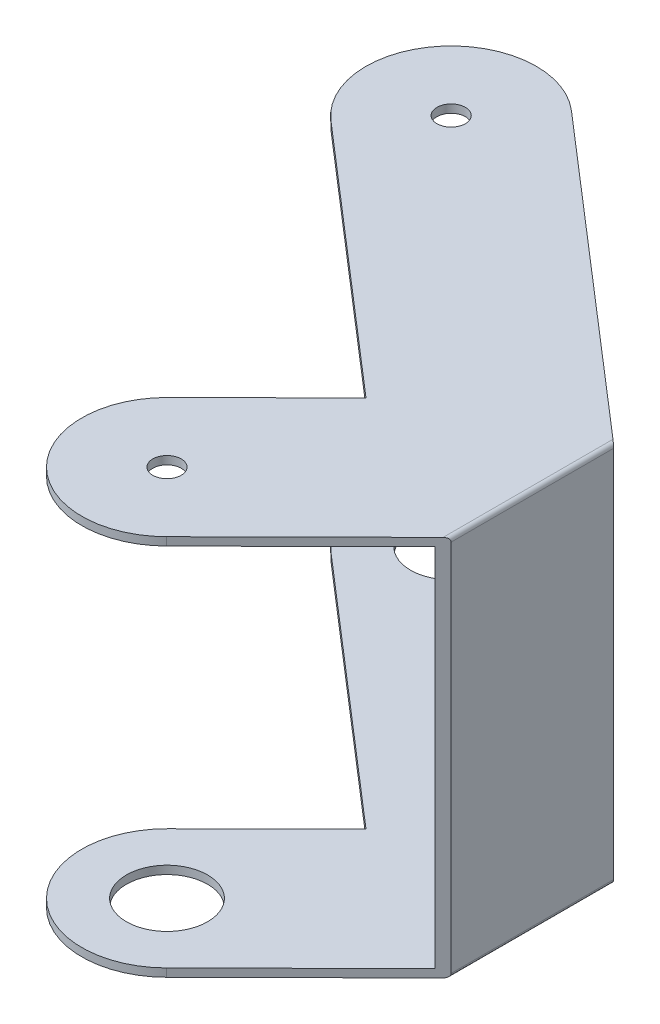
ISO-10303-21;
HEADER;
FILE_DESCRIPTION(('STEP AP214'),'2;1');
FILE_NAME('part.step','',(''),(''),'','','');
FILE_SCHEMA(('AUTOMOTIVE_DESIGN { 1 0 10303 214 1 1 1 1 }'));
ENDSEC;
DATA;
#1=APPLICATION_CONTEXT('core data for automotive mechanical design processes');
#2=APPLICATION_PROTOCOL_DEFINITION('international standard','automotive_design',2000,#1);
#3=PRODUCT_CONTEXT('',#1,'mechanical');
#4=PRODUCT('Part','Part','',(#3));
#5=PRODUCT_RELATED_PRODUCT_CATEGORY('part','',(#4));
#6=PRODUCT_DEFINITION_FORMATION('','',#4);
#7=PRODUCT_DEFINITION_CONTEXT('part definition',#1,'design');
#8=PRODUCT_DEFINITION('design','',#6,#7);
#9=PRODUCT_DEFINITION_SHAPE('','',#8);
#10=(LENGTH_UNIT() NAMED_UNIT(*) SI_UNIT(.MILLI.,.METRE.));
#11=(NAMED_UNIT(*) PLANE_ANGLE_UNIT() SI_UNIT($,.RADIAN.));
#12=(NAMED_UNIT(*) SI_UNIT($,.STERADIAN.) SOLID_ANGLE_UNIT());
#13=UNCERTAINTY_MEASURE_WITH_UNIT(LENGTH_MEASURE(1.E-05),#10,'distance_accuracy_value','');
#14=(GEOMETRIC_REPRESENTATION_CONTEXT(3) GLOBAL_UNCERTAINTY_ASSIGNED_CONTEXT((#13)) GLOBAL_UNIT_ASSIGNED_CONTEXT((#10,
#11,#12)) REPRESENTATION_CONTEXT('',''));
#15=CARTESIAN_POINT('',(0.,0.,0.));
#16=DIRECTION('',(0.,0.,1.));
#17=DIRECTION('',(1.,0.,0.));
#18=AXIS2_PLACEMENT_3D('',#15,#16,#17);
#19=CARTESIAN_POINT('',(-20.,0.,-55.));
#20=DIRECTION('',(0.,1.,0.));
#21=DIRECTION('',(0.,0.,1.));
#22=AXIS2_PLACEMENT_3D('',#19,#20,#21);
#23=PLANE('',#22);
#24=DIRECTION('',(-0.756723379962,0.,-0.65373521109));
#25=VECTOR('',#24,1.);
#26=CARTESIAN_POINT('',(25.,0.,-30.));
#27=LINE('',#26,#25);
#28=CARTESIAN_POINT('',(24.5,0.,-30.4319512442729));
#29=VERTEX_POINT('',#28);
#30=CARTESIAN_POINT('',(-13.135780283555,0.,-62.945595489601));
#31=VERTEX_POINT('',#30);
#32=EDGE_CURVE('E208',#29,#31,#27,.T.);
#33=ORIENTED_EDGE('',*,*,#32,.F.);
#34=DIRECTION('',(0.,0.,1.));
#35=VECTOR('',#34,1.);
#36=CARTESIAN_POINT('',(24.5,0.,-10.));
#37=LINE('',#36,#35);
#38=CARTESIAN_POINT('',(24.5,0.,-9.50428499112912));
#39=VERTEX_POINT('',#38);
#40=EDGE_CURVE('E257',#29,#39,#37,.T.);
#41=ORIENTED_EDGE('',*,*,#40,.T.);
#42=DIRECTION('',(-0.710143190911547,0.,0.704057276364619));
#43=VECTOR('',#42,1.);
#44=CARTESIAN_POINT('',(25.,0.,-10.));
#45=LINE('',#44,#43);
#46=CARTESIAN_POINT('',(7.3926014018285,0.,7.45650350457125));
#47=VERTEX_POINT('',#46);
#48=EDGE_CURVE('E231',#39,#47,#45,.T.);
#49=ORIENTED_EDGE('',*,*,#48,.T.);
#50=CARTESIAN_POINT('',(0.,0.,0.));
#51=DIRECTION('',(0.,1.,0.));
#52=DIRECTION('',(0.,0.,1.));
#53=AXIS2_PLACEMENT_3D('',#50,#51,#52);
#54=CIRCLE('',#53,10.5);
#55=CARTESIAN_POINT('',(-7.3926014018285,0.,-7.45650350457125));
#56=VERTEX_POINT('',#55);
#57=EDGE_CURVE('E228',#56,#47,#54,.T.);
#58=ORIENTED_EDGE('',*,*,#57,.F.);
#59=DIRECTION('',(0.710143190911547,0.,-0.704057276364619));
#60=VECTOR('',#59,1.);
#61=CARTESIAN_POINT('',(-7.3926014018285,0.,-7.45650350457125));
#62=LINE('',#61,#60);
#63=CARTESIAN_POINT('',(4.88353854108096,0.,-19.6274371459702));
#64=VERTEX_POINT('',#63);
#65=EDGE_CURVE('E225',#56,#64,#62,.T.);
#66=ORIENTED_EDGE('',*,*,#65,.T.);
#67=DIRECTION('',(0.756723379962,0.,0.65373521109));
#68=VECTOR('',#67,1.);
#69=CARTESIAN_POINT('',(-26.864219716445,0.,-47.054404510399));
#70=LINE('',#69,#68);
#71=CARTESIAN_POINT('',(-26.864219716445,0.,-47.054404510399));
#72=VERTEX_POINT('',#71);
#73=EDGE_CURVE('E222',#72,#64,#70,.T.);
#74=ORIENTED_EDGE('',*,*,#73,.F.);
#75=CARTESIAN_POINT('',(-20.,0.,-55.));
#76=DIRECTION('',(0.,1.,0.));
#77=DIRECTION('',(0.,0.,1.));
#78=AXIS2_PLACEMENT_3D('',#75,#76,#77);
#79=CIRCLE('',#78,10.5);
#80=EDGE_CURVE('E193',#31,#72,#79,.T.);
#81=ORIENTED_EDGE('',*,*,#80,.F.);
#82=EDGE_LOOP('',(#33,#41,#49,#58,#66,#74,#81));
#83=FACE_BOUND('',#82,.T.);
#84=CARTESIAN_POINT('',(-20.,0.,-55.));
#85=DIRECTION('',(0.,-1.,0.));
#86=DIRECTION('',(0.,0.,-1.));
#87=AXIS2_PLACEMENT_3D('',#84,#85,#86);
#88=CIRCLE('',#87,5.);
#89=CARTESIAN_POINT('',(-20.,0.,-60.));
#90=VERTEX_POINT('',#89);
#91=EDGE_CURVE('E312',#90,#90,#88,.T.);
#92=ORIENTED_EDGE('',*,*,#91,.F.);
#93=EDGE_LOOP('',(#92));
#94=FACE_BOUND('',#93,.T.);
#95=CARTESIAN_POINT('',(0.,0.,0.));
#96=DIRECTION('',(0.,-1.,0.));
#97=DIRECTION('',(0.,0.,-1.));
#98=AXIS2_PLACEMENT_3D('',#95,#96,#97);
#99=CIRCLE('',#98,5.);
#100=CARTESIAN_POINT('',(0.,0.,-5.));
#101=VERTEX_POINT('',#100);
#102=EDGE_CURVE('E318',#101,#101,#99,.T.);
#103=ORIENTED_EDGE('',*,*,#102,.F.);
#104=EDGE_LOOP('',(#103));
#105=FACE_BOUND('',#104,.T.);
#106=ADVANCED_FACE('F35',(#83,#94,#105),#23,.F.);
#107=CARTESIAN_POINT('',(-20.,47.,-55.));
#108=DIRECTION('',(0.,-1.,0.));
#109=DIRECTION('',(0.,0.,-1.));
#110=AXIS2_PLACEMENT_3D('',#107,#108,#109);
#111=CYLINDRICAL_SURFACE('',#110,10.5);
#112=CARTESIAN_POINT('',(-20.,1.,-55.));
#113=DIRECTION('',(0.,1.,0.));
#114=DIRECTION('',(0.,0.,1.));
#115=AXIS2_PLACEMENT_3D('',#112,#113,#114);
#116=CIRCLE('',#115,10.5);
#117=CARTESIAN_POINT('',(-13.135780283555,1.,-62.945595489601));
#118=VERTEX_POINT('',#117);
#119=CARTESIAN_POINT('',(-26.864219716445,1.,-47.054404510399));
#120=VERTEX_POINT('',#119);
#121=EDGE_CURVE('E181',#118,#120,#116,.T.);
#122=ORIENTED_EDGE('',*,*,#121,.F.);
#123=DIRECTION('',(0.,-1.,0.));
#124=VECTOR('',#123,1.);
#125=CARTESIAN_POINT('',(-13.135780283555,47.,-62.945595489601));
#126=LINE('',#125,#124);
#127=EDGE_CURVE('E173',#118,#31,#126,.T.);
#128=ORIENTED_EDGE('',*,*,#127,.T.);
#129=ORIENTED_EDGE('',*,*,#80,.T.);
#130=DIRECTION('',(0.,-1.,0.));
#131=VECTOR('',#130,1.);
#132=CARTESIAN_POINT('',(-26.864219716445,47.,-47.054404510399));
#133=LINE('',#132,#131);
#134=EDGE_CURVE('E253',#120,#72,#133,.T.);
#135=ORIENTED_EDGE('',*,*,#134,.F.);
#136=EDGE_LOOP('',(#122,#128,#129,#135));
#137=FACE_BOUND('',#136,.T.);
#138=ADVANCED_FACE('F326',(#137),#111,.T.);
#139=CARTESIAN_POINT('',(-26.864219716445,47.,-47.054404510399));
#140=DIRECTION('',(0.65373521109,0.,-0.756723379962));
#141=DIRECTION('',(-0.756723379962,0.,-0.65373521109));
#142=AXIS2_PLACEMENT_3D('',#139,#140,#141);
#143=PLANE('',#142);
#144=DIRECTION('',(0.756723379962,0.,0.65373521109));
#145=VECTOR('',#144,1.);
#146=CARTESIAN_POINT('',(-26.864219716445,1.,-47.054404510399));
#147=LINE('',#146,#145);
#148=CARTESIAN_POINT('',(4.88353854108096,1.,-19.6274371459702));
#149=VERTEX_POINT('',#148);
#150=EDGE_CURVE('E183',#120,#149,#147,.T.);
#151=ORIENTED_EDGE('',*,*,#150,.F.);
#152=ORIENTED_EDGE('',*,*,#134,.T.);
#153=ORIENTED_EDGE('',*,*,#73,.T.);
#154=DIRECTION('',(0.,-1.,0.));
#155=VECTOR('',#154,1.);
#156=CARTESIAN_POINT('',(4.88353854108096,47.,-19.6274371459702));
#157=LINE('',#156,#155);
#158=EDGE_CURVE('E249',#149,#64,#157,.T.);
#159=ORIENTED_EDGE('',*,*,#158,.F.);
#160=EDGE_LOOP('',(#151,#152,#153,#159));
#161=FACE_BOUND('',#160,.T.);
#162=ADVANCED_FACE('F331',(#161),#143,.F.);
#163=CARTESIAN_POINT('',(-7.3926014018285,47.,-7.45650350457125));
#164=DIRECTION('',(-0.704057276364619,0.,-0.710143190911547));
#165=DIRECTION('',(-0.710143190911547,0.,0.704057276364619));
#166=AXIS2_PLACEMENT_3D('',#163,#164,#165);
#167=PLANE('',#166);
#168=DIRECTION('',(0.,-1.,0.));
#169=VECTOR('',#168,1.);
#170=CARTESIAN_POINT('',(-7.3926014018285,47.,-7.45650350457125));
#171=LINE('',#170,#169);
#172=CARTESIAN_POINT('',(-7.3926014018285,1.,-7.45650350457125));
#173=VERTEX_POINT('',#172);
#174=EDGE_CURVE('E245',#173,#56,#171,.T.);
#175=ORIENTED_EDGE('',*,*,#174,.F.);
#176=DIRECTION('',(0.710143190911547,0.,-0.704057276364619));
#177=VECTOR('',#176,1.);
#178=CARTESIAN_POINT('',(-7.3926014018285,1.,-7.45650350457125));
#179=LINE('',#178,#177);
#180=EDGE_CURVE('E186',#173,#149,#179,.T.);
#181=ORIENTED_EDGE('',*,*,#180,.T.);
#182=ORIENTED_EDGE('',*,*,#158,.T.);
#183=ORIENTED_EDGE('',*,*,#65,.F.);
#184=EDGE_LOOP('',(#175,#181,#182,#183));
#185=FACE_BOUND('',#184,.T.);
#186=ADVANCED_FACE('F352',(#185),#167,.T.);
#187=CARTESIAN_POINT('',(0.,47.,0.));
#188=DIRECTION('',(0.,-1.,0.));
#189=DIRECTION('',(0.,0.,-1.));
#190=AXIS2_PLACEMENT_3D('',#187,#188,#189);
#191=CYLINDRICAL_SURFACE('',#190,10.5);
#192=CARTESIAN_POINT('',(0.,1.,0.));
#193=DIRECTION('',(0.,1.,0.));
#194=DIRECTION('',(0.,0.,1.));
#195=AXIS2_PLACEMENT_3D('',#192,#193,#194);
#196=CIRCLE('',#195,10.5);
#197=CARTESIAN_POINT('',(7.3926014018285,1.,7.45650350457125));
#198=VERTEX_POINT('',#197);
#199=EDGE_CURVE('E189',#173,#198,#196,.T.);
#200=ORIENTED_EDGE('',*,*,#199,.F.);
#201=ORIENTED_EDGE('',*,*,#174,.T.);
#202=ORIENTED_EDGE('',*,*,#57,.T.);
#203=DIRECTION('',(0.,-1.,0.));
#204=VECTOR('',#203,1.);
#205=CARTESIAN_POINT('',(7.3926014018285,47.,7.45650350457125));
#206=LINE('',#205,#204);
#207=EDGE_CURVE('E241',#198,#47,#206,.T.);
#208=ORIENTED_EDGE('',*,*,#207,.F.);
#209=EDGE_LOOP('',(#200,#201,#202,#208));
#210=FACE_BOUND('',#209,.T.);
#211=ADVANCED_FACE('F344',(#210),#191,.T.);
#212=CARTESIAN_POINT('',(25.,47.,-10.));
#213=DIRECTION('',(0.704057276364619,0.,0.710143190911547));
#214=DIRECTION('',(0.710143190911547,0.,-0.704057276364619));
#215=AXIS2_PLACEMENT_3D('',#212,#213,#214);
#216=PLANE('',#215);
#217=ORIENTED_EDGE('',*,*,#48,.F.);
#218=CARTESIAN_POINT('',(24.5,0.5,-9.50428499112913));
#219=DIRECTION('',(0.704057276364619,0.,0.710143190911547));
#220=DIRECTION('',(0.710143190911547,0.,-0.704057276364619));
#221=AXIS2_PLACEMENT_3D('',#218,#219,#220);
#222=ELLIPSE('',#221,0.704083354454465,0.5);
#223=CARTESIAN_POINT('',(25.,0.5,-10.));
#224=VERTEX_POINT('',#223);
#225=EDGE_CURVE('E262',#39,#224,#222,.T.);
#226=ORIENTED_EDGE('',*,*,#225,.T.);
#227=DIRECTION('',(0.,-1.,0.));
#228=VECTOR('',#227,1.);
#229=CARTESIAN_POINT('',(25.,47.,-10.));
#230=LINE('',#229,#228);
#231=CARTESIAN_POINT('',(25.,46.5,-10.));
#232=VERTEX_POINT('',#231);
#233=EDGE_CURVE('E239',#232,#224,#230,.T.);
#234=ORIENTED_EDGE('',*,*,#233,.F.);
#235=CARTESIAN_POINT('',(24.5,46.5,-9.50428499112913));
#236=DIRECTION('',(0.704057276364619,0.,0.710143190911547));
#237=DIRECTION('',(-0.710143190911547,0.,0.704057276364619));
#238=AXIS2_PLACEMENT_3D('',#235,#236,#237);
#239=ELLIPSE('',#238,0.704083354454465,0.5);
#240=CARTESIAN_POINT('',(24.5,47.,-9.50428499112912));
#241=VERTEX_POINT('',#240);
#242=EDGE_CURVE('E260',#232,#241,#239,.T.);
#243=ORIENTED_EDGE('',*,*,#242,.T.);
#244=DIRECTION('',(-0.710143190911547,0.,0.704057276364619));
#245=VECTOR('',#244,1.);
#246=CARTESIAN_POINT('',(25.,47.,-10.));
#247=LINE('',#246,#245);
#248=CARTESIAN_POINT('',(7.3926014018285,47.,7.45650350457125));
#249=VERTEX_POINT('',#248);
#250=EDGE_CURVE('E216',#241,#249,#247,.T.);
#251=ORIENTED_EDGE('',*,*,#250,.T.);
#252=CARTESIAN_POINT('',(7.3926014018285,46.,7.45650350457125));
#253=VERTEX_POINT('',#252);
#254=EDGE_CURVE('E242',#249,#253,#206,.T.);
#255=ORIENTED_EDGE('',*,*,#254,.T.);
#256=DIRECTION('',(-0.710143190911547,0.,0.704057276364619));
#257=VECTOR('',#256,1.);
#258=CARTESIAN_POINT('',(25.,46.,-10.));
#259=LINE('',#258,#257);
#260=CARTESIAN_POINT('',(24.,46.,-9.00856998225825));
#261=VERTEX_POINT('',#260);
#262=EDGE_CURVE('E194',#261,#253,#259,.T.);
#263=ORIENTED_EDGE('',*,*,#262,.F.);
#264=DIRECTION('',(0.,-1.,0.));
#265=VECTOR('',#264,1.);
#266=CARTESIAN_POINT('',(24.,47.,-9.00856998225825));
#267=LINE('',#266,#265);
#268=CARTESIAN_POINT('',(24.,1.,-9.00856998225825));
#269=VERTEX_POINT('',#268);
#270=EDGE_CURVE('E160',#261,#269,#267,.T.);
#271=ORIENTED_EDGE('',*,*,#270,.T.);
#272=DIRECTION('',(-0.710143190911547,0.,0.704057276364619));
#273=VECTOR('',#272,1.);
#274=CARTESIAN_POINT('',(25.,1.,-10.));
#275=LINE('',#274,#273);
#276=EDGE_CURVE('E168',#269,#198,#275,.T.);
#277=ORIENTED_EDGE('',*,*,#276,.T.);
#278=ORIENTED_EDGE('',*,*,#207,.T.);
#279=EDGE_LOOP('',(#217,#226,#234,#243,#251,#255,#263,#271,#277,#278));
#280=FACE_BOUND('',#279,.T.);
#281=ADVANCED_FACE('F281',(#280),#216,.T.);
#282=CARTESIAN_POINT('',(25.,47.,-30.));
#283=DIRECTION('',(-0.65373521109,0.,0.756723379962));
#284=DIRECTION('',(0.756723379962,0.,0.65373521109));
#285=AXIS2_PLACEMENT_3D('',#282,#283,#284);
#286=PLANE('',#285);
#287=DIRECTION('',(0.,-1.,0.));
#288=VECTOR('',#287,1.);
#289=CARTESIAN_POINT('',(25.,47.,-30.));
#290=LINE('',#289,#288);
#291=CARTESIAN_POINT('',(25.,46.5,-30.));
#292=VERTEX_POINT('',#291);
#293=CARTESIAN_POINT('',(25.,0.5,-30.));
#294=VERTEX_POINT('',#293);
#295=EDGE_CURVE('E237',#292,#294,#290,.T.);
#296=ORIENTED_EDGE('',*,*,#295,.T.);
#297=CARTESIAN_POINT('',(24.5,0.5,-30.4319512442729));
#298=DIRECTION('',(-0.65373521109,0.,0.756723379962));
#299=DIRECTION('',(-0.756723379962,0.,-0.65373521109));
#300=AXIS2_PLACEMENT_3D('',#297,#298,#299);
#301=ELLIPSE('',#300,0.660743427836349,0.5);
#302=EDGE_CURVE('E43',#294,#29,#301,.F.);
#303=ORIENTED_EDGE('',*,*,#302,.T.);
#304=ORIENTED_EDGE('',*,*,#32,.T.);
#305=ORIENTED_EDGE('',*,*,#127,.F.);
#306=DIRECTION('',(-0.756723379962,0.,-0.65373521109));
#307=VECTOR('',#306,1.);
#308=CARTESIAN_POINT('',(25.,1.,-30.));
#309=LINE('',#308,#307);
#310=CARTESIAN_POINT('',(24.,1.,-30.8639024885459));
#311=VERTEX_POINT('',#310);
#312=EDGE_CURVE('E165',#311,#118,#309,.T.);
#313=ORIENTED_EDGE('',*,*,#312,.F.);
#314=DIRECTION('',(0.,-1.,0.));
#315=VECTOR('',#314,1.);
#316=CARTESIAN_POINT('',(24.,47.,-30.8639024885459));
#317=LINE('',#316,#315);
#318=CARTESIAN_POINT('',(24.,46.,-30.8639024885459));
#319=VERTEX_POINT('',#318);
#320=EDGE_CURVE('E149',#319,#311,#317,.T.);
#321=ORIENTED_EDGE('',*,*,#320,.F.);
#322=DIRECTION('',(-0.756723379962,0.,-0.65373521109));
#323=VECTOR('',#322,1.);
#324=CARTESIAN_POINT('',(25.,46.,-30.));
#325=LINE('',#324,#323);
#326=CARTESIAN_POINT('',(-13.135780283555,46.,-62.945595489601));
#327=VERTEX_POINT('',#326);
#328=EDGE_CURVE('E161',#319,#327,#325,.T.);
#329=ORIENTED_EDGE('',*,*,#328,.T.);
#330=CARTESIAN_POINT('',(-13.135780283555,47.,-62.945595489601));
#331=VERTEX_POINT('',#330);
#332=EDGE_CURVE('E234',#331,#327,#126,.T.);
#333=ORIENTED_EDGE('',*,*,#332,.F.);
#334=DIRECTION('',(-0.756723379962,0.,-0.65373521109));
#335=VECTOR('',#334,1.);
#336=CARTESIAN_POINT('',(25.,47.,-30.));
#337=LINE('',#336,#335);
#338=CARTESIAN_POINT('',(24.5,47.,-30.4319512442729));
#339=VERTEX_POINT('',#338);
#340=EDGE_CURVE('E218',#339,#331,#337,.T.);
#341=ORIENTED_EDGE('',*,*,#340,.F.);
#342=CARTESIAN_POINT('',(24.5,46.5,-30.4319512442729));
#343=DIRECTION('',(-0.65373521109,0.,0.756723379962));
#344=DIRECTION('',(0.756723379962,0.,0.65373521109));
#345=AXIS2_PLACEMENT_3D('',#342,#343,#344);
#346=ELLIPSE('',#345,0.660743427836349,0.5);
#347=EDGE_CURVE('E268',#339,#292,#346,.F.);
#348=ORIENTED_EDGE('',*,*,#347,.T.);
#349=EDGE_LOOP('',(#296,#303,#304,#305,#313,#321,#329,#333,#341,#348));
#350=FACE_BOUND('',#349,.T.);
#351=ADVANCED_FACE('F171',(#350),#286,.F.);
#352=ORIENTED_EDGE('',*,*,#332,.T.);
#353=CARTESIAN_POINT('',(-20.,46.,-55.));
#354=DIRECTION('',(0.,1.,0.));
#355=DIRECTION('',(0.,0.,1.));
#356=AXIS2_PLACEMENT_3D('',#353,#354,#355);
#357=CIRCLE('',#356,10.5);
#358=CARTESIAN_POINT('',(-26.864219716445,46.,-47.054404510399));
#359=VERTEX_POINT('',#358);
#360=EDGE_CURVE('E174',#327,#359,#357,.T.);
#361=ORIENTED_EDGE('',*,*,#360,.T.);
#362=CARTESIAN_POINT('',(-26.864219716445,47.,-47.054404510399));
#363=VERTEX_POINT('',#362);
#364=EDGE_CURVE('E254',#363,#359,#133,.T.);
#365=ORIENTED_EDGE('',*,*,#364,.F.);
#366=CARTESIAN_POINT('',(-20.,47.,-55.));
#367=DIRECTION('',(0.,1.,0.));
#368=DIRECTION('',(0.,0.,1.));
#369=AXIS2_PLACEMENT_3D('',#366,#367,#368);
#370=CIRCLE('',#369,10.5);
#371=EDGE_CURVE('E204',#331,#363,#370,.T.);
#372=ORIENTED_EDGE('',*,*,#371,.F.);
#373=EDGE_LOOP('',(#352,#361,#365,#372));
#374=FACE_BOUND('',#373,.T.);
#375=ADVANCED_FACE('F334',(#374),#111,.T.);
#376=ORIENTED_EDGE('',*,*,#364,.T.);
#377=DIRECTION('',(0.756723379962,0.,0.65373521109));
#378=VECTOR('',#377,1.);
#379=CARTESIAN_POINT('',(-26.864219716445,46.,-47.054404510399));
#380=LINE('',#379,#378);
#381=CARTESIAN_POINT('',(4.88353854108096,46.,-19.6274371459702));
#382=VERTEX_POINT('',#381);
#383=EDGE_CURVE('E177',#359,#382,#380,.T.);
#384=ORIENTED_EDGE('',*,*,#383,.T.);
#385=CARTESIAN_POINT('',(4.88353854108096,47.,-19.6274371459702));
#386=VERTEX_POINT('',#385);
#387=EDGE_CURVE('E250',#386,#382,#157,.T.);
#388=ORIENTED_EDGE('',*,*,#387,.F.);
#389=DIRECTION('',(0.756723379962,0.,0.65373521109));
#390=VECTOR('',#389,1.);
#391=CARTESIAN_POINT('',(-26.864219716445,47.,-47.054404510399));
#392=LINE('',#391,#390);
#393=EDGE_CURVE('E207',#363,#386,#392,.T.);
#394=ORIENTED_EDGE('',*,*,#393,.F.);
#395=EDGE_LOOP('',(#376,#384,#388,#394));
#396=FACE_BOUND('',#395,.T.);
#397=ADVANCED_FACE('F350',(#396),#143,.F.);
#398=DIRECTION('',(0.710143190911547,0.,-0.704057276364619));
#399=VECTOR('',#398,1.);
#400=CARTESIAN_POINT('',(-7.3926014018285,46.,-7.45650350457125));
#401=LINE('',#400,#399);
#402=CARTESIAN_POINT('',(-7.3926014018285,46.,-7.45650350457125));
#403=VERTEX_POINT('',#402);
#404=EDGE_CURVE('E199',#403,#382,#401,.T.);
#405=ORIENTED_EDGE('',*,*,#404,.F.);
#406=CARTESIAN_POINT('',(-7.3926014018285,47.,-7.45650350457125));
#407=VERTEX_POINT('',#406);
#408=EDGE_CURVE('E246',#407,#403,#171,.T.);
#409=ORIENTED_EDGE('',*,*,#408,.F.);
#410=DIRECTION('',(0.710143190911547,0.,-0.704057276364619));
#411=VECTOR('',#410,1.);
#412=CARTESIAN_POINT('',(-7.3926014018285,47.,-7.45650350457125));
#413=LINE('',#412,#411);
#414=EDGE_CURVE('E210',#407,#386,#413,.T.);
#415=ORIENTED_EDGE('',*,*,#414,.T.);
#416=ORIENTED_EDGE('',*,*,#387,.T.);
#417=EDGE_LOOP('',(#405,#409,#415,#416));
#418=FACE_BOUND('',#417,.T.);
#419=ADVANCED_FACE('F347',(#418),#167,.T.);
#420=ORIENTED_EDGE('',*,*,#408,.T.);
#421=CARTESIAN_POINT('',(0.,46.,0.));
#422=DIRECTION('',(0.,1.,0.));
#423=DIRECTION('',(0.,0.,1.));
#424=AXIS2_PLACEMENT_3D('',#421,#422,#423);
#425=CIRCLE('',#424,10.5);
#426=EDGE_CURVE('E196',#403,#253,#425,.T.);
#427=ORIENTED_EDGE('',*,*,#426,.T.);
#428=ORIENTED_EDGE('',*,*,#254,.F.);
#429=CARTESIAN_POINT('',(0.,47.,0.));
#430=DIRECTION('',(0.,1.,0.));
#431=DIRECTION('',(0.,0.,1.));
#432=AXIS2_PLACEMENT_3D('',#429,#430,#431);
#433=CIRCLE('',#432,10.5);
#434=EDGE_CURVE('E213',#407,#249,#433,.T.);
#435=ORIENTED_EDGE('',*,*,#434,.F.);
#436=EDGE_LOOP('',(#420,#427,#428,#435));
#437=FACE_BOUND('',#436,.T.);
#438=ADVANCED_FACE('F292',(#437),#191,.T.);
#439=CARTESIAN_POINT('',(25.,47.,-30.));
#440=DIRECTION('',(1.,0.,0.));
#441=DIRECTION('',(0.,0.,-1.));
#442=AXIS2_PLACEMENT_3D('',#439,#440,#441);
#443=PLANE('',#442);
#444=ORIENTED_EDGE('',*,*,#233,.T.);
#445=DIRECTION('',(0.,0.,1.));
#446=VECTOR('',#445,1.);
#447=CARTESIAN_POINT('',(25.,0.5,-30.));
#448=LINE('',#447,#446);
#449=EDGE_CURVE('E56',#224,#294,#448,.F.);
#450=ORIENTED_EDGE('',*,*,#449,.T.);
#451=ORIENTED_EDGE('',*,*,#295,.F.);
#452=DIRECTION('',(0.,0.,1.));
#453=VECTOR('',#452,1.);
#454=CARTESIAN_POINT('',(25.,46.5,-30.));
#455=LINE('',#454,#453);
#456=EDGE_CURVE('E264',#292,#232,#455,.T.);
#457=ORIENTED_EDGE('',*,*,#456,.T.);
#458=EDGE_LOOP('',(#444,#450,#451,#457));
#459=FACE_BOUND('',#458,.T.);
#460=ADVANCED_FACE('F283',(#459),#443,.T.);
#461=CARTESIAN_POINT('',(-20.,47.,-55.));
#462=DIRECTION('',(0.,1.,0.));
#463=DIRECTION('',(0.,0.,1.));
#464=AXIS2_PLACEMENT_3D('',#461,#462,#463);
#465=PLANE('',#464);
#466=CARTESIAN_POINT('',(0.,47.,0.));
#467=DIRECTION('',(0.,1.,0.));
#468=DIRECTION('',(0.,0.,1.));
#469=AXIS2_PLACEMENT_3D('',#466,#467,#468);
#470=CIRCLE('',#469,1.75);
#471=CARTESIAN_POINT('',(0.,47.,1.75));
#472=VERTEX_POINT('',#471);
#473=EDGE_CURVE('E306',#472,#472,#470,.T.);
#474=ORIENTED_EDGE('',*,*,#473,.F.);
#475=EDGE_LOOP('',(#474));
#476=FACE_BOUND('',#475,.T.);
#477=CARTESIAN_POINT('',(-20.,47.,-55.));
#478=DIRECTION('',(0.,1.,0.));
#479=DIRECTION('',(0.,0.,1.));
#480=AXIS2_PLACEMENT_3D('',#477,#478,#479);
#481=CIRCLE('',#480,1.75);
#482=CARTESIAN_POINT('',(-20.,47.,-53.25));
#483=VERTEX_POINT('',#482);
#484=EDGE_CURVE('E300',#483,#483,#481,.T.);
#485=ORIENTED_EDGE('',*,*,#484,.F.);
#486=EDGE_LOOP('',(#485));
#487=FACE_BOUND('',#486,.T.);
#488=ORIENTED_EDGE('',*,*,#250,.F.);
#489=DIRECTION('',(0.,0.,1.));
#490=VECTOR('',#489,1.);
#491=CARTESIAN_POINT('',(24.5,47.,-55.));
#492=LINE('',#491,#490);
#493=EDGE_CURVE('E11',#241,#339,#492,.F.);
#494=ORIENTED_EDGE('',*,*,#493,.T.);
#495=ORIENTED_EDGE('',*,*,#340,.T.);
#496=ORIENTED_EDGE('',*,*,#371,.T.);
#497=ORIENTED_EDGE('',*,*,#393,.T.);
#498=ORIENTED_EDGE('',*,*,#414,.F.);
#499=ORIENTED_EDGE('',*,*,#434,.T.);
#500=EDGE_LOOP('',(#488,#494,#495,#496,#497,#498,#499));
#501=FACE_BOUND('',#500,.T.);
#502=ADVANCED_FACE('F287',(#476,#487,#501),#465,.T.);
#503=CARTESIAN_POINT('',(24.,47.,-30.));
#504=DIRECTION('',(1.,0.,0.));
#505=DIRECTION('',(0.,0.,-1.));
#506=AXIS2_PLACEMENT_3D('',#503,#504,#505);
#507=PLANE('',#506);
#508=DIRECTION('',(0.,0.,1.));
#509=VECTOR('',#508,1.);
#510=CARTESIAN_POINT('',(24.,1.,-30.));
#511=LINE('',#510,#509);
#512=EDGE_CURVE('E152',#311,#269,#511,.T.);
#513=ORIENTED_EDGE('',*,*,#512,.T.);
#514=ORIENTED_EDGE('',*,*,#270,.F.);
#515=DIRECTION('',(0.,0.,1.));
#516=VECTOR('',#515,1.);
#517=CARTESIAN_POINT('',(24.,46.,-30.));
#518=LINE('',#517,#516);
#519=EDGE_CURVE('E155',#319,#261,#518,.T.);
#520=ORIENTED_EDGE('',*,*,#519,.F.);
#521=ORIENTED_EDGE('',*,*,#320,.T.);
#522=EDGE_LOOP('',(#513,#514,#520,#521));
#523=FACE_BOUND('',#522,.T.);
#524=ADVANCED_FACE('F151',(#523),#507,.F.);
#525=CARTESIAN_POINT('',(-20.,46.,-55.));
#526=DIRECTION('',(0.,1.,0.));
#527=DIRECTION('',(0.,0.,1.));
#528=AXIS2_PLACEMENT_3D('',#525,#526,#527);
#529=PLANE('',#528);
#530=CARTESIAN_POINT('',(0.,46.,0.));
#531=DIRECTION('',(0.,1.,0.));
#532=DIRECTION('',(0.,0.,1.));
#533=AXIS2_PLACEMENT_3D('',#530,#531,#532);
#534=CIRCLE('',#533,1.75);
#535=CARTESIAN_POINT('',(0.,46.,1.75));
#536=VERTEX_POINT('',#535);
#537=EDGE_CURVE('E303',#536,#536,#534,.T.);
#538=ORIENTED_EDGE('',*,*,#537,.T.);
#539=EDGE_LOOP('',(#538));
#540=FACE_BOUND('',#539,.T.);
#541=CARTESIAN_POINT('',(-20.,46.,-55.));
#542=DIRECTION('',(0.,1.,0.));
#543=DIRECTION('',(0.,0.,1.));
#544=AXIS2_PLACEMENT_3D('',#541,#542,#543);
#545=CIRCLE('',#544,1.75);
#546=CARTESIAN_POINT('',(-20.,46.,-53.25));
#547=VERTEX_POINT('',#546);
#548=EDGE_CURVE('E184',#547,#547,#545,.T.);
#549=ORIENTED_EDGE('',*,*,#548,.T.);
#550=EDGE_LOOP('',(#549));
#551=FACE_BOUND('',#550,.T.);
#552=ORIENTED_EDGE('',*,*,#360,.F.);
#553=ORIENTED_EDGE('',*,*,#328,.F.);
#554=ORIENTED_EDGE('',*,*,#519,.T.);
#555=ORIENTED_EDGE('',*,*,#262,.T.);
#556=ORIENTED_EDGE('',*,*,#426,.F.);
#557=ORIENTED_EDGE('',*,*,#404,.T.);
#558=ORIENTED_EDGE('',*,*,#383,.F.);
#559=EDGE_LOOP('',(#552,#553,#554,#555,#556,#557,#558));
#560=FACE_BOUND('',#559,.T.);
#561=ADVANCED_FACE('F295',(#540,#551,#560),#529,.F.);
#562=CARTESIAN_POINT('',(-20.,1.,-55.));
#563=DIRECTION('',(0.,1.,0.));
#564=DIRECTION('',(0.,0.,1.));
#565=AXIS2_PLACEMENT_3D('',#562,#563,#564);
#566=PLANE('',#565);
#567=CARTESIAN_POINT('',(0.,1.,0.));
#568=DIRECTION('',(0.,1.,0.));
#569=DIRECTION('',(0.,0.,1.));
#570=AXIS2_PLACEMENT_3D('',#567,#568,#569);
#571=CIRCLE('',#570,5.);
#572=CARTESIAN_POINT('',(0.,1.,5.));
#573=VERTEX_POINT('',#572);
#574=EDGE_CURVE('E315',#573,#573,#571,.T.);
#575=ORIENTED_EDGE('',*,*,#574,.F.);
#576=EDGE_LOOP('',(#575));
#577=FACE_BOUND('',#576,.T.);
#578=CARTESIAN_POINT('',(-20.,1.,-55.));
#579=DIRECTION('',(0.,1.,0.));
#580=DIRECTION('',(0.,0.,1.));
#581=AXIS2_PLACEMENT_3D('',#578,#579,#580);
#582=CIRCLE('',#581,5.);
#583=CARTESIAN_POINT('',(-20.,1.,-50.));
#584=VERTEX_POINT('',#583);
#585=EDGE_CURVE('E309',#584,#584,#582,.T.);
#586=ORIENTED_EDGE('',*,*,#585,.F.);
#587=EDGE_LOOP('',(#586));
#588=FACE_BOUND('',#587,.T.);
#589=ORIENTED_EDGE('',*,*,#121,.T.);
#590=ORIENTED_EDGE('',*,*,#150,.T.);
#591=ORIENTED_EDGE('',*,*,#180,.F.);
#592=ORIENTED_EDGE('',*,*,#199,.T.);
#593=ORIENTED_EDGE('',*,*,#276,.F.);
#594=ORIENTED_EDGE('',*,*,#512,.F.);
#595=ORIENTED_EDGE('',*,*,#312,.T.);
#596=EDGE_LOOP('',(#589,#590,#591,#592,#593,#594,#595));
#597=FACE_BOUND('',#596,.T.);
#598=ADVANCED_FACE('F164',(#577,#588,#597),#566,.T.);
#599=CARTESIAN_POINT('',(24.5,0.5,-55.));
#600=DIRECTION('',(0.,0.,-1.));
#601=DIRECTION('',(-1.,0.,0.));
#602=AXIS2_PLACEMENT_3D('',#599,#600,#601);
#603=CYLINDRICAL_SURFACE('',#602,0.5);
#604=ORIENTED_EDGE('',*,*,#302,.F.);
#605=ORIENTED_EDGE('',*,*,#449,.F.);
#606=ORIENTED_EDGE('',*,*,#225,.F.);
#607=ORIENTED_EDGE('',*,*,#40,.F.);
#608=EDGE_LOOP('',(#604,#605,#606,#607));
#609=FACE_BOUND('',#608,.T.);
#610=ADVANCED_FACE('F278',(#609),#603,.T.);
#611=CARTESIAN_POINT('',(24.5,46.5,-30.));
#612=DIRECTION('',(0.,0.,1.));
#613=DIRECTION('',(1.,0.,0.));
#614=AXIS2_PLACEMENT_3D('',#611,#612,#613);
#615=CYLINDRICAL_SURFACE('',#614,0.5);
#616=ORIENTED_EDGE('',*,*,#347,.F.);
#617=ORIENTED_EDGE('',*,*,#493,.F.);
#618=ORIENTED_EDGE('',*,*,#242,.F.);
#619=ORIENTED_EDGE('',*,*,#456,.F.);
#620=EDGE_LOOP('',(#616,#617,#618,#619));
#621=FACE_BOUND('',#620,.T.);
#622=ADVANCED_FACE('F37',(#621),#615,.T.);
#623=CARTESIAN_POINT('',(-20.,47.,-55.));
#624=DIRECTION('',(0.,1.,0.));
#625=DIRECTION('',(0.,0.,1.));
#626=AXIS2_PLACEMENT_3D('',#623,#624,#625);
#627=CYLINDRICAL_SURFACE('',#626,1.75);
#628=ORIENTED_EDGE('',*,*,#548,.F.);
#629=EDGE_LOOP('',(#628));
#630=FACE_BOUND('',#629,.T.);
#631=ORIENTED_EDGE('',*,*,#484,.T.);
#632=EDGE_LOOP('',(#631));
#633=FACE_BOUND('',#632,.T.);
#634=ADVANCED_FACE('F362',(#630,#633),#627,.F.);
#635=CARTESIAN_POINT('',(0.,47.,0.));
#636=DIRECTION('',(0.,1.,0.));
#637=DIRECTION('',(0.,0.,1.));
#638=AXIS2_PLACEMENT_3D('',#635,#636,#637);
#639=CYLINDRICAL_SURFACE('',#638,1.75);
#640=ORIENTED_EDGE('',*,*,#537,.F.);
#641=EDGE_LOOP('',(#640));
#642=FACE_BOUND('',#641,.T.);
#643=ORIENTED_EDGE('',*,*,#473,.T.);
#644=EDGE_LOOP('',(#643));
#645=FACE_BOUND('',#644,.T.);
#646=ADVANCED_FACE('F376',(#642,#645),#639,.F.);
#647=CARTESIAN_POINT('',(-20.,0.,-55.));
#648=DIRECTION('',(0.,-1.,0.));
#649=DIRECTION('',(0.,0.,-1.));
#650=AXIS2_PLACEMENT_3D('',#647,#648,#649);
#651=CYLINDRICAL_SURFACE('',#650,5.);
#652=ORIENTED_EDGE('',*,*,#91,.T.);
#653=EDGE_LOOP('',(#652));
#654=FACE_BOUND('',#653,.T.);
#655=ORIENTED_EDGE('',*,*,#585,.T.);
#656=EDGE_LOOP('',(#655));
#657=FACE_BOUND('',#656,.T.);
#658=ADVANCED_FACE('F380',(#654,#657),#651,.F.);
#659=CARTESIAN_POINT('',(0.,0.,0.));
#660=DIRECTION('',(0.,-1.,0.));
#661=DIRECTION('',(0.,0.,-1.));
#662=AXIS2_PLACEMENT_3D('',#659,#660,#661);
#663=CYLINDRICAL_SURFACE('',#662,5.);
#664=ORIENTED_EDGE('',*,*,#102,.T.);
#665=EDGE_LOOP('',(#664));
#666=FACE_BOUND('',#665,.T.);
#667=ORIENTED_EDGE('',*,*,#574,.T.);
#668=EDGE_LOOP('',(#667));
#669=FACE_BOUND('',#668,.T.);
#670=ADVANCED_FACE('F322',(#666,#669),#663,.F.);
#671=CLOSED_SHELL('',(#106,#138,#162,#186,#211,#281,#351,#375,#397,#419,#438,#460,#502,#524,
#561,#598,#610,#622,#634,#646,#658,#670));
#672=MANIFOLD_SOLID_BREP('B2',#671);
#673=ADVANCED_BREP_SHAPE_REPRESENTATION('',(#18,#672),#14);
#674=SHAPE_DEFINITION_REPRESENTATION(#9,#673);
ENDSEC;
END-ISO-10303-21;
